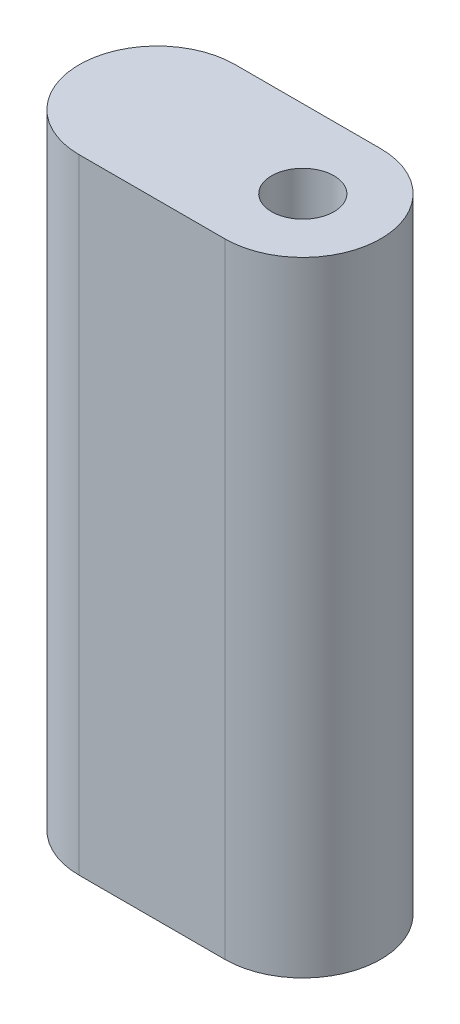
ISO-10303-21;
HEADER;
FILE_DESCRIPTION(('STEP AP214'),'2;1');
FILE_NAME('part.step','',(''),(''),'','','');
FILE_SCHEMA(('AUTOMOTIVE_DESIGN { 1 0 10303 214 1 1 1 1 }'));
ENDSEC;
DATA;
#1=APPLICATION_CONTEXT('core data for automotive mechanical design processes');
#2=APPLICATION_PROTOCOL_DEFINITION('international standard','automotive_design',2000,#1);
#3=PRODUCT_CONTEXT('',#1,'mechanical');
#4=PRODUCT('Part','Part','',(#3));
#5=PRODUCT_RELATED_PRODUCT_CATEGORY('part','',(#4));
#6=PRODUCT_DEFINITION_FORMATION('','',#4);
#7=PRODUCT_DEFINITION_CONTEXT('part definition',#1,'design');
#8=PRODUCT_DEFINITION('design','',#6,#7);
#9=PRODUCT_DEFINITION_SHAPE('','',#8);
#10=(LENGTH_UNIT() NAMED_UNIT(*) SI_UNIT(.MILLI.,.METRE.));
#11=(NAMED_UNIT(*) PLANE_ANGLE_UNIT() SI_UNIT($,.RADIAN.));
#12=(NAMED_UNIT(*) SI_UNIT($,.STERADIAN.) SOLID_ANGLE_UNIT());
#13=UNCERTAINTY_MEASURE_WITH_UNIT(LENGTH_MEASURE(1.E-05),#10,'distance_accuracy_value','');
#14=(GEOMETRIC_REPRESENTATION_CONTEXT(3) GLOBAL_UNCERTAINTY_ASSIGNED_CONTEXT((#13)) GLOBAL_UNIT_ASSIGNED_CONTEXT((#10,
#11,#12)) REPRESENTATION_CONTEXT('',''));
#15=CARTESIAN_POINT('',(0.,0.,0.));
#16=DIRECTION('',(0.,0.,1.));
#17=DIRECTION('',(1.,0.,0.));
#18=AXIS2_PLACEMENT_3D('',#15,#16,#17);
#19=CARTESIAN_POINT('',(0.,30.,-3.75));
#20=DIRECTION('',(0.,0.,-1.));
#21=DIRECTION('',(-1.,0.,0.));
#22=AXIS2_PLACEMENT_3D('',#19,#20,#21);
#23=PLANE('',#22);
#24=DIRECTION('',(1.,0.,0.));
#25=VECTOR('',#24,1.);
#26=CARTESIAN_POINT('',(0.,0.,-3.75));
#27=LINE('',#26,#25);
#28=CARTESIAN_POINT('',(0.,0.,-3.75));
#29=VERTEX_POINT('',#28);
#30=CARTESIAN_POINT('',(7.,0.,-3.75));
#31=VERTEX_POINT('',#30);
#32=EDGE_CURVE('E97',#29,#31,#27,.T.);
#33=ORIENTED_EDGE('',*,*,#32,.F.);
#34=DIRECTION('',(0.,-1.,0.));
#35=VECTOR('',#34,1.);
#36=CARTESIAN_POINT('',(0.,30.,-3.75));
#37=LINE('',#36,#35);
#38=CARTESIAN_POINT('',(0.,30.,-3.75));
#39=VERTEX_POINT('',#38);
#40=EDGE_CURVE('E11',#39,#29,#37,.T.);
#41=ORIENTED_EDGE('',*,*,#40,.F.);
#42=DIRECTION('',(1.,0.,0.));
#43=VECTOR('',#42,1.);
#44=CARTESIAN_POINT('',(0.,30.,-3.75));
#45=LINE('',#44,#43);
#46=CARTESIAN_POINT('',(7.,30.,-3.75));
#47=VERTEX_POINT('',#46);
#48=EDGE_CURVE('E85',#39,#47,#45,.T.);
#49=ORIENTED_EDGE('',*,*,#48,.T.);
#50=DIRECTION('',(0.,-1.,0.));
#51=VECTOR('',#50,1.);
#52=CARTESIAN_POINT('',(7.,30.,-3.75));
#53=LINE('',#52,#51);
#54=EDGE_CURVE('E74',#47,#31,#53,.T.);
#55=ORIENTED_EDGE('',*,*,#54,.T.);
#56=EDGE_LOOP('',(#33,#41,#49,#55));
#57=FACE_BOUND('',#56,.T.);
#58=ADVANCED_FACE('F35',(#57),#23,.T.);
#59=CARTESIAN_POINT('',(0.,30.,0.));
#60=DIRECTION('',(0.,-1.,0.));
#61=DIRECTION('',(0.,0.,-1.));
#62=AXIS2_PLACEMENT_3D('',#59,#60,#61);
#63=CYLINDRICAL_SURFACE('',#62,3.75);
#64=CARTESIAN_POINT('',(0.,0.,0.));
#65=DIRECTION('',(0.,1.,0.));
#66=DIRECTION('',(0.,0.,1.));
#67=AXIS2_PLACEMENT_3D('',#64,#65,#66);
#68=CIRCLE('',#67,3.75);
#69=CARTESIAN_POINT('',(0.,0.,3.75));
#70=VERTEX_POINT('',#69);
#71=EDGE_CURVE('E90',#29,#70,#68,.T.);
#72=ORIENTED_EDGE('',*,*,#71,.T.);
#73=DIRECTION('',(0.,-1.,0.));
#74=VECTOR('',#73,1.);
#75=CARTESIAN_POINT('',(0.,30.,3.75));
#76=LINE('',#75,#74);
#77=CARTESIAN_POINT('',(0.,30.,3.75));
#78=VERTEX_POINT('',#77);
#79=EDGE_CURVE('E43',#78,#70,#76,.T.);
#80=ORIENTED_EDGE('',*,*,#79,.F.);
#81=CARTESIAN_POINT('',(0.,30.,0.));
#82=DIRECTION('',(0.,1.,0.));
#83=DIRECTION('',(0.,0.,1.));
#84=AXIS2_PLACEMENT_3D('',#81,#82,#83);
#85=CIRCLE('',#84,3.75);
#86=EDGE_CURVE('E80',#39,#78,#85,.T.);
#87=ORIENTED_EDGE('',*,*,#86,.F.);
#88=ORIENTED_EDGE('',*,*,#40,.T.);
#89=EDGE_LOOP('',(#72,#80,#87,#88));
#90=FACE_BOUND('',#89,.T.);
#91=ADVANCED_FACE('F88',(#90),#63,.T.);
#92=CARTESIAN_POINT('',(0.,30.,3.75));
#93=DIRECTION('',(0.,0.,-1.));
#94=DIRECTION('',(-1.,0.,0.));
#95=AXIS2_PLACEMENT_3D('',#92,#93,#94);
#96=PLANE('',#95);
#97=DIRECTION('',(1.,0.,0.));
#98=VECTOR('',#97,1.);
#99=CARTESIAN_POINT('',(0.,0.,3.75));
#100=LINE('',#99,#98);
#101=CARTESIAN_POINT('',(7.,0.,3.75));
#102=VERTEX_POINT('',#101);
#103=EDGE_CURVE('E67',#70,#102,#100,.T.);
#104=ORIENTED_EDGE('',*,*,#103,.T.);
#105=DIRECTION('',(0.,-1.,0.));
#106=VECTOR('',#105,1.);
#107=CARTESIAN_POINT('',(7.,30.,3.75));
#108=LINE('',#107,#106);
#109=CARTESIAN_POINT('',(7.,30.,3.75));
#110=VERTEX_POINT('',#109);
#111=EDGE_CURVE('E91',#110,#102,#108,.T.);
#112=ORIENTED_EDGE('',*,*,#111,.F.);
#113=DIRECTION('',(1.,0.,0.));
#114=VECTOR('',#113,1.);
#115=CARTESIAN_POINT('',(0.,30.,3.75));
#116=LINE('',#115,#114);
#117=EDGE_CURVE('E84',#78,#110,#116,.T.);
#118=ORIENTED_EDGE('',*,*,#117,.F.);
#119=ORIENTED_EDGE('',*,*,#79,.T.);
#120=EDGE_LOOP('',(#104,#112,#118,#119));
#121=FACE_BOUND('',#120,.T.);
#122=ADVANCED_FACE('F92',(#121),#96,.F.);
#123=CARTESIAN_POINT('',(7.,30.,0.));
#124=DIRECTION('',(0.,-1.,0.));
#125=DIRECTION('',(0.,0.,-1.));
#126=AXIS2_PLACEMENT_3D('',#123,#124,#125);
#127=CYLINDRICAL_SURFACE('',#126,3.75);
#128=CARTESIAN_POINT('',(7.,0.,0.));
#129=DIRECTION('',(0.,1.,0.));
#130=DIRECTION('',(0.,0.,1.));
#131=AXIS2_PLACEMENT_3D('',#128,#129,#130);
#132=CIRCLE('',#131,3.75);
#133=EDGE_CURVE('E103',#102,#31,#132,.T.);
#134=ORIENTED_EDGE('',*,*,#133,.T.);
#135=ORIENTED_EDGE('',*,*,#54,.F.);
#136=CARTESIAN_POINT('',(7.,30.,0.));
#137=DIRECTION('',(0.,1.,0.));
#138=DIRECTION('',(0.,0.,1.));
#139=AXIS2_PLACEMENT_3D('',#136,#137,#138);
#140=CIRCLE('',#139,3.75);
#141=EDGE_CURVE('E51',#110,#47,#140,.T.);
#142=ORIENTED_EDGE('',*,*,#141,.F.);
#143=ORIENTED_EDGE('',*,*,#111,.T.);
#144=EDGE_LOOP('',(#134,#135,#142,#143));
#145=FACE_BOUND('',#144,.T.);
#146=ADVANCED_FACE('F108',(#145),#127,.T.);
#147=CARTESIAN_POINT('',(0.,30.,0.));
#148=DIRECTION('',(0.,1.,0.));
#149=DIRECTION('',(0.,0.,1.));
#150=AXIS2_PLACEMENT_3D('',#147,#148,#149);
#151=PLANE('',#150);
#152=CARTESIAN_POINT('',(7.,30.,0.));
#153=DIRECTION('',(0.,1.,0.));
#154=DIRECTION('',(0.,0.,1.));
#155=AXIS2_PLACEMENT_3D('',#152,#153,#154);
#156=CIRCLE('',#155,1.5);
#157=CARTESIAN_POINT('',(7.,30.,1.5));
#158=VERTEX_POINT('',#157);
#159=EDGE_CURVE('E144',#158,#158,#156,.T.);
#160=ORIENTED_EDGE('',*,*,#159,.F.);
#161=EDGE_LOOP('',(#160));
#162=FACE_BOUND('',#161,.T.);
#163=ORIENTED_EDGE('',*,*,#48,.F.);
#164=ORIENTED_EDGE('',*,*,#86,.T.);
#165=ORIENTED_EDGE('',*,*,#117,.T.);
#166=ORIENTED_EDGE('',*,*,#141,.T.);
#167=EDGE_LOOP('',(#163,#164,#165,#166));
#168=FACE_BOUND('',#167,.T.);
#169=ADVANCED_FACE('F82',(#162,#168),#151,.T.);
#170=CARTESIAN_POINT('',(0.,0.,0.));
#171=DIRECTION('',(0.,1.,0.));
#172=DIRECTION('',(0.,0.,1.));
#173=AXIS2_PLACEMENT_3D('',#170,#171,#172);
#174=PLANE('',#173);
#175=CARTESIAN_POINT('',(0.,0.,0.));
#176=DIRECTION('',(0.,-1.,0.));
#177=DIRECTION('',(0.,0.,-1.));
#178=AXIS2_PLACEMENT_3D('',#175,#176,#177);
#179=CIRCLE('',#178,1.5);
#180=CARTESIAN_POINT('',(0.,0.,-1.5));
#181=VERTEX_POINT('',#180);
#182=EDGE_CURVE('E145',#181,#181,#179,.T.);
#183=ORIENTED_EDGE('',*,*,#182,.F.);
#184=EDGE_LOOP('',(#183));
#185=FACE_BOUND('',#184,.T.);
#186=CARTESIAN_POINT('',(7.,0.,0.));
#187=DIRECTION('',(0.,1.,0.));
#188=DIRECTION('',(0.,0.,1.));
#189=AXIS2_PLACEMENT_3D('',#186,#187,#188);
#190=CIRCLE('',#189,1.5);
#191=CARTESIAN_POINT('',(7.,0.,1.5));
#192=VERTEX_POINT('',#191);
#193=EDGE_CURVE('E100',#192,#192,#190,.T.);
#194=ORIENTED_EDGE('',*,*,#193,.T.);
#195=EDGE_LOOP('',(#194));
#196=FACE_BOUND('',#195,.T.);
#197=ORIENTED_EDGE('',*,*,#32,.T.);
#198=ORIENTED_EDGE('',*,*,#133,.F.);
#199=ORIENTED_EDGE('',*,*,#103,.F.);
#200=ORIENTED_EDGE('',*,*,#71,.F.);
#201=EDGE_LOOP('',(#197,#198,#199,#200));
#202=FACE_BOUND('',#201,.T.);
#203=ADVANCED_FACE('F110',(#185,#196,#202),#174,.F.);
#204=CARTESIAN_POINT('',(7.,0.,0.));
#205=DIRECTION('',(0.,1.,0.));
#206=DIRECTION('',(0.,0.,1.));
#207=AXIS2_PLACEMENT_3D('',#204,#205,#206);
#208=CYLINDRICAL_SURFACE('',#207,1.5);
#209=ORIENTED_EDGE('',*,*,#193,.F.);
#210=EDGE_LOOP('',(#209));
#211=FACE_BOUND('',#210,.T.);
#212=ORIENTED_EDGE('',*,*,#159,.T.);
#213=EDGE_LOOP('',(#212));
#214=FACE_BOUND('',#213,.T.);
#215=ADVANCED_FACE('F124',(#211,#214),#208,.F.);
#216=CARTESIAN_POINT('',(0.,10.,0.));
#217=DIRECTION('',(0.,-1.,0.));
#218=DIRECTION('',(0.,0.,-1.));
#219=AXIS2_PLACEMENT_3D('',#216,#217,#218);
#220=CYLINDRICAL_SURFACE('',#219,1.5);
#221=CARTESIAN_POINT('',(0.,10.,0.));
#222=DIRECTION('',(0.,-1.,0.));
#223=DIRECTION('',(0.,0.,-1.));
#224=AXIS2_PLACEMENT_3D('',#221,#222,#223);
#225=CIRCLE('',#224,1.5);
#226=CARTESIAN_POINT('',(0.,10.,-1.5));
#227=VERTEX_POINT('',#226);
#228=EDGE_CURVE('E143',#227,#227,#225,.T.);
#229=ORIENTED_EDGE('',*,*,#228,.F.);
#230=EDGE_LOOP('',(#229));
#231=FACE_BOUND('',#230,.T.);
#232=ORIENTED_EDGE('',*,*,#182,.T.);
#233=EDGE_LOOP('',(#232));
#234=FACE_BOUND('',#233,.T.);
#235=ADVANCED_FACE('F131',(#231,#234),#220,.F.);
#236=CARTESIAN_POINT('',(0.,10.,0.));
#237=DIRECTION('',(0.,-1.,0.));
#238=DIRECTION('',(0.,0.,-1.));
#239=AXIS2_PLACEMENT_3D('',#236,#237,#238);
#240=PLANE('',#239);
#241=ORIENTED_EDGE('',*,*,#228,.T.);
#242=EDGE_LOOP('',(#241));
#243=FACE_BOUND('',#242,.T.);
#244=ADVANCED_FACE('F135',(#243),#240,.T.);
#245=CLOSED_SHELL('',(#58,#91,#122,#146,#169,#203,#215,#235,#244));
#246=MANIFOLD_SOLID_BREP('B2',#245);
#247=ADVANCED_BREP_SHAPE_REPRESENTATION('',(#18,#246),#14);
#248=SHAPE_DEFINITION_REPRESENTATION(#9,#247);
ENDSEC;
END-ISO-10303-21;
